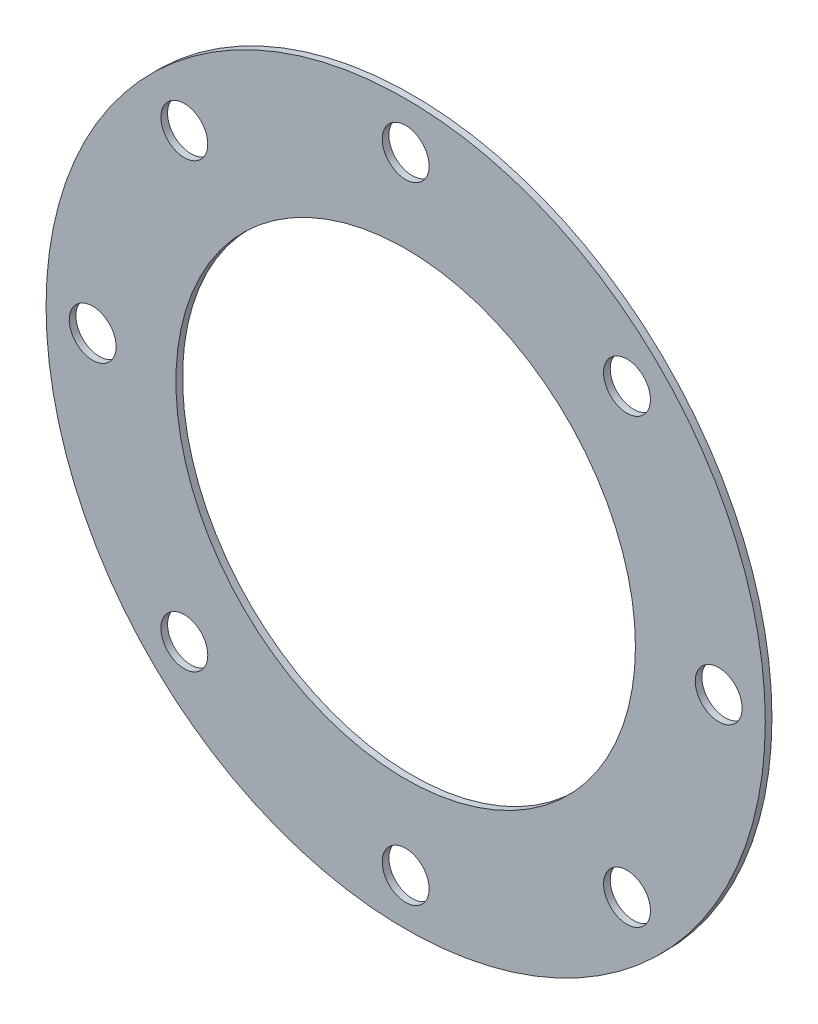
ISO-10303-21;
HEADER;
FILE_DESCRIPTION(('STEP AP214'),'2;1');
FILE_NAME('part.step','',(''),(''),'','','');
FILE_SCHEMA(('AUTOMOTIVE_DESIGN { 1 0 10303 214 1 1 1 1 }'));
ENDSEC;
DATA;
#1=APPLICATION_CONTEXT('core data for automotive mechanical design processes');
#2=APPLICATION_PROTOCOL_DEFINITION('international standard','automotive_design',2000,#1);
#3=PRODUCT_CONTEXT('',#1,'mechanical');
#4=PRODUCT('Part','Part','',(#3));
#5=PRODUCT_RELATED_PRODUCT_CATEGORY('part','',(#4));
#6=PRODUCT_DEFINITION_FORMATION('','',#4);
#7=PRODUCT_DEFINITION_CONTEXT('part definition',#1,'design');
#8=PRODUCT_DEFINITION('design','',#6,#7);
#9=PRODUCT_DEFINITION_SHAPE('','',#8);
#10=(LENGTH_UNIT() NAMED_UNIT(*) SI_UNIT(.MILLI.,.METRE.));
#11=(NAMED_UNIT(*) PLANE_ANGLE_UNIT() SI_UNIT($,.RADIAN.));
#12=(NAMED_UNIT(*) SI_UNIT($,.STERADIAN.) SOLID_ANGLE_UNIT());
#13=UNCERTAINTY_MEASURE_WITH_UNIT(LENGTH_MEASURE(1.E-05),#10,'distance_accuracy_value','');
#14=(GEOMETRIC_REPRESENTATION_CONTEXT(3) GLOBAL_UNCERTAINTY_ASSIGNED_CONTEXT((#13)) GLOBAL_UNIT_ASSIGNED_CONTEXT((#10,
#11,#12)) REPRESENTATION_CONTEXT('',''));
#15=CARTESIAN_POINT('',(0.,0.,0.));
#16=DIRECTION('',(0.,0.,1.));
#17=DIRECTION('',(1.,0.,0.));
#18=AXIS2_PLACEMENT_3D('',#15,#16,#17);
#19=CARTESIAN_POINT('',(0.,0.,1.5875));
#20=DIRECTION('',(0.,0.,1.));
#21=DIRECTION('',(1.,0.,0.));
#22=AXIS2_PLACEMENT_3D('',#19,#20,#21);
#23=PLANE('',#22);
#24=CARTESIAN_POINT('',(-105.518009422561,105.518009422564,1.5875));
#25=DIRECTION('',(0.,0.,1.));
#26=DIRECTION('',(0.707106781186556,0.707106781186539,0.));
#27=AXIS2_PLACEMENT_3D('',#24,#25,#26);
#28=CIRCLE('',#27,11.176);
#29=CARTESIAN_POINT('',(-97.6153840360203,113.420634809105,1.5875));
#30=VERTEX_POINT('',#29);
#31=EDGE_CURVE('E92',#30,#30,#28,.T.);
#32=ORIENTED_EDGE('',*,*,#31,.F.);
#33=EDGE_LOOP('',(#32));
#34=FACE_BOUND('',#33,.T.);
#35=CARTESIAN_POINT('',(-149.225,1.5630489083666E-12,1.5875));
#36=DIRECTION('',(0.,0.,1.));
#37=DIRECTION('',(0.,1.,0.));
#38=AXIS2_PLACEMENT_3D('',#35,#36,#37);
#39=CIRCLE('',#38,11.176);
#40=CARTESIAN_POINT('',(-149.225,11.1760000000016,1.5875));
#41=VERTEX_POINT('',#40);
#42=EDGE_CURVE('E86',#41,#41,#39,.T.);
#43=ORIENTED_EDGE('',*,*,#42,.F.);
#44=EDGE_LOOP('',(#43));
#45=FACE_BOUND('',#44,.T.);
#46=CARTESIAN_POINT('',(-105.518009422563,-105.518009422562,1.5875));
#47=DIRECTION('',(0.,0.,1.));
#48=DIRECTION('',(-0.707106781186541,0.707106781186554,0.));
#49=AXIS2_PLACEMENT_3D('',#46,#47,#48);
#50=CIRCLE('',#49,11.176);
#51=CARTESIAN_POINT('',(-113.420634809104,-97.6153840360207,1.5875));
#52=VERTEX_POINT('',#51);
#53=EDGE_CURVE('E80',#52,#52,#50,.T.);
#54=ORIENTED_EDGE('',*,*,#53,.F.);
#55=EDGE_LOOP('',(#54));
#56=FACE_BOUND('',#55,.T.);
#57=CARTESIAN_POINT('',(0.,-149.225,1.5875));
#58=DIRECTION('',(0.,0.,1.));
#59=DIRECTION('',(-1.,0.,0.));
#60=AXIS2_PLACEMENT_3D('',#57,#58,#59);
#61=CIRCLE('',#60,11.176);
#62=CARTESIAN_POINT('',(-11.176,-149.225,1.5875));
#63=VERTEX_POINT('',#62);
#64=EDGE_CURVE('E74',#63,#63,#61,.T.);
#65=ORIENTED_EDGE('',*,*,#64,.F.);
#66=EDGE_LOOP('',(#65));
#67=FACE_BOUND('',#66,.T.);
#68=CARTESIAN_POINT('',(105.518009422562,-105.518009422563,1.5875));
#69=DIRECTION('',(0.,0.,1.));
#70=DIRECTION('',(-0.707106781186551,-0.707106781186544,0.));
#71=AXIS2_PLACEMENT_3D('',#68,#69,#70);
#72=CIRCLE('',#71,11.176);
#73=CARTESIAN_POINT('',(97.6153840360211,-113.420634809104,1.5875));
#74=VERTEX_POINT('',#73);
#75=EDGE_CURVE('E68',#74,#74,#72,.T.);
#76=ORIENTED_EDGE('',*,*,#75,.F.);
#77=EDGE_LOOP('',(#76));
#78=FACE_BOUND('',#77,.T.);
#79=CARTESIAN_POINT('',(149.225,-5.21016302788867E-13,1.5875));
#80=DIRECTION('',(0.,0.,1.));
#81=DIRECTION('',(0.,-1.,0.));
#82=AXIS2_PLACEMENT_3D('',#79,#80,#81);
#83=CIRCLE('',#82,11.176);
#84=CARTESIAN_POINT('',(149.225,-11.1760000000005,1.5875));
#85=VERTEX_POINT('',#84);
#86=EDGE_CURVE('E62',#85,#85,#83,.T.);
#87=ORIENTED_EDGE('',*,*,#86,.F.);
#88=EDGE_LOOP('',(#87));
#89=FACE_BOUND('',#88,.T.);
#90=CARTESIAN_POINT('',(105.518009422563,105.518009422562,1.5875));
#91=DIRECTION('',(0.,0.,1.));
#92=DIRECTION('',(0.707106781186546,-0.707106781186549,0.));
#93=AXIS2_PLACEMENT_3D('',#90,#91,#92);
#94=CIRCLE('',#93,11.176);
#95=CARTESIAN_POINT('',(113.420634809104,97.6153840360215,1.5875));
#96=VERTEX_POINT('',#95);
#97=EDGE_CURVE('E56',#96,#96,#94,.T.);
#98=ORIENTED_EDGE('',*,*,#97,.F.);
#99=EDGE_LOOP('',(#98));
#100=FACE_BOUND('',#99,.T.);
#101=CARTESIAN_POINT('',(0.,149.225,1.5875));
#102=DIRECTION('',(0.,0.,1.));
#103=DIRECTION('',(1.,0.,0.));
#104=AXIS2_PLACEMENT_3D('',#101,#102,#103);
#105=CIRCLE('',#104,11.176);
#106=CARTESIAN_POINT('',(11.176,149.225,1.5875));
#107=VERTEX_POINT('',#106);
#108=EDGE_CURVE('E53',#107,#107,#105,.T.);
#109=ORIENTED_EDGE('',*,*,#108,.F.);
#110=EDGE_LOOP('',(#109));
#111=FACE_BOUND('',#110,.T.);
#112=CARTESIAN_POINT('',(0.,0.,1.5875));
#113=DIRECTION('',(0.,0.,1.));
#114=DIRECTION('',(1.,0.,0.));
#115=AXIS2_PLACEMENT_3D('',#112,#113,#114);
#116=CIRCLE('',#115,171.45);
#117=CARTESIAN_POINT('',(171.45,0.,1.5875));
#118=VERTEX_POINT('',#117);
#119=EDGE_CURVE('E10',#118,#118,#116,.T.);
#120=ORIENTED_EDGE('',*,*,#119,.T.);
#121=EDGE_LOOP('',(#120));
#122=FACE_BOUND('',#121,.T.);
#123=CARTESIAN_POINT('',(0.,0.,1.5875));
#124=DIRECTION('',(0.,0.,1.));
#125=DIRECTION('',(1.,0.,0.));
#126=AXIS2_PLACEMENT_3D('',#123,#124,#125);
#127=CIRCLE('',#126,109.5375);
#128=CARTESIAN_POINT('',(109.5375,0.,1.5875));
#129=VERTEX_POINT('',#128);
#130=EDGE_CURVE('E43',#129,#129,#127,.T.);
#131=ORIENTED_EDGE('',*,*,#130,.F.);
#132=EDGE_LOOP('',(#131));
#133=FACE_BOUND('',#132,.T.);
#134=ADVANCED_FACE('F32',(#34,#45,#56,#67,#78,#89,#100,#111,#122,#133),#23,.T.);
#135=CARTESIAN_POINT('',(0.,0.,-1.5875));
#136=DIRECTION('',(0.,0.,1.));
#137=DIRECTION('',(1.,0.,0.));
#138=AXIS2_PLACEMENT_3D('',#135,#136,#137);
#139=PLANE('',#138);
#140=CARTESIAN_POINT('',(-105.518009422561,105.518009422564,-1.5875));
#141=DIRECTION('',(0.,0.,1.));
#142=DIRECTION('',(0.707106781186556,0.707106781186539,0.));
#143=AXIS2_PLACEMENT_3D('',#140,#141,#142);
#144=CIRCLE('',#143,11.176);
#145=CARTESIAN_POINT('',(-97.6153840360203,113.420634809105,-1.5875));
#146=VERTEX_POINT('',#145);
#147=EDGE_CURVE('E95',#146,#146,#144,.T.);
#148=ORIENTED_EDGE('',*,*,#147,.T.);
#149=EDGE_LOOP('',(#148));
#150=FACE_BOUND('',#149,.T.);
#151=CARTESIAN_POINT('',(-149.225,1.5630489083666E-12,-1.5875));
#152=DIRECTION('',(0.,0.,1.));
#153=DIRECTION('',(0.,1.,0.));
#154=AXIS2_PLACEMENT_3D('',#151,#152,#153);
#155=CIRCLE('',#154,11.176);
#156=CARTESIAN_POINT('',(-149.225,11.1760000000016,-1.5875));
#157=VERTEX_POINT('',#156);
#158=EDGE_CURVE('E89',#157,#157,#155,.T.);
#159=ORIENTED_EDGE('',*,*,#158,.T.);
#160=EDGE_LOOP('',(#159));
#161=FACE_BOUND('',#160,.T.);
#162=CARTESIAN_POINT('',(-105.518009422563,-105.518009422562,-1.5875));
#163=DIRECTION('',(0.,0.,1.));
#164=DIRECTION('',(-0.707106781186541,0.707106781186554,0.));
#165=AXIS2_PLACEMENT_3D('',#162,#163,#164);
#166=CIRCLE('',#165,11.176);
#167=CARTESIAN_POINT('',(-113.420634809104,-97.6153840360207,-1.5875));
#168=VERTEX_POINT('',#167);
#169=EDGE_CURVE('E83',#168,#168,#166,.T.);
#170=ORIENTED_EDGE('',*,*,#169,.T.);
#171=EDGE_LOOP('',(#170));
#172=FACE_BOUND('',#171,.T.);
#173=CARTESIAN_POINT('',(0.,-149.225,-1.5875));
#174=DIRECTION('',(0.,0.,1.));
#175=DIRECTION('',(-1.,0.,0.));
#176=AXIS2_PLACEMENT_3D('',#173,#174,#175);
#177=CIRCLE('',#176,11.176);
#178=CARTESIAN_POINT('',(-11.176,-149.225,-1.5875));
#179=VERTEX_POINT('',#178);
#180=EDGE_CURVE('E77',#179,#179,#177,.T.);
#181=ORIENTED_EDGE('',*,*,#180,.T.);
#182=EDGE_LOOP('',(#181));
#183=FACE_BOUND('',#182,.T.);
#184=CARTESIAN_POINT('',(105.518009422562,-105.518009422563,-1.5875));
#185=DIRECTION('',(0.,0.,1.));
#186=DIRECTION('',(-0.707106781186551,-0.707106781186544,0.));
#187=AXIS2_PLACEMENT_3D('',#184,#185,#186);
#188=CIRCLE('',#187,11.176);
#189=CARTESIAN_POINT('',(97.6153840360211,-113.420634809104,-1.5875));
#190=VERTEX_POINT('',#189);
#191=EDGE_CURVE('E71',#190,#190,#188,.T.);
#192=ORIENTED_EDGE('',*,*,#191,.T.);
#193=EDGE_LOOP('',(#192));
#194=FACE_BOUND('',#193,.T.);
#195=CARTESIAN_POINT('',(149.225,-5.21016302788867E-13,-1.5875));
#196=DIRECTION('',(0.,0.,1.));
#197=DIRECTION('',(0.,-1.,0.));
#198=AXIS2_PLACEMENT_3D('',#195,#196,#197);
#199=CIRCLE('',#198,11.176);
#200=CARTESIAN_POINT('',(149.225,-11.1760000000005,-1.5875));
#201=VERTEX_POINT('',#200);
#202=EDGE_CURVE('E65',#201,#201,#199,.T.);
#203=ORIENTED_EDGE('',*,*,#202,.T.);
#204=EDGE_LOOP('',(#203));
#205=FACE_BOUND('',#204,.T.);
#206=CARTESIAN_POINT('',(105.518009422563,105.518009422562,-1.5875));
#207=DIRECTION('',(0.,0.,1.));
#208=DIRECTION('',(0.707106781186546,-0.707106781186549,0.));
#209=AXIS2_PLACEMENT_3D('',#206,#207,#208);
#210=CIRCLE('',#209,11.176);
#211=CARTESIAN_POINT('',(113.420634809104,97.6153840360215,-1.5875));
#212=VERTEX_POINT('',#211);
#213=EDGE_CURVE('E59',#212,#212,#210,.T.);
#214=ORIENTED_EDGE('',*,*,#213,.T.);
#215=EDGE_LOOP('',(#214));
#216=FACE_BOUND('',#215,.T.);
#217=CARTESIAN_POINT('',(0.,149.225,-1.5875));
#218=DIRECTION('',(0.,0.,1.));
#219=DIRECTION('',(1.,0.,0.));
#220=AXIS2_PLACEMENT_3D('',#217,#218,#219);
#221=CIRCLE('',#220,11.176);
#222=CARTESIAN_POINT('',(11.176,149.225,-1.5875));
#223=VERTEX_POINT('',#222);
#224=EDGE_CURVE('E48',#223,#223,#221,.T.);
#225=ORIENTED_EDGE('',*,*,#224,.T.);
#226=EDGE_LOOP('',(#225));
#227=FACE_BOUND('',#226,.T.);
#228=CARTESIAN_POINT('',(0.,0.,-1.5875));
#229=DIRECTION('',(0.,0.,1.));
#230=DIRECTION('',(1.,0.,0.));
#231=AXIS2_PLACEMENT_3D('',#228,#229,#230);
#232=CIRCLE('',#231,171.45);
#233=CARTESIAN_POINT('',(171.45,0.,-1.5875));
#234=VERTEX_POINT('',#233);
#235=EDGE_CURVE('E36',#234,#234,#232,.T.);
#236=ORIENTED_EDGE('',*,*,#235,.F.);
#237=EDGE_LOOP('',(#236));
#238=FACE_BOUND('',#237,.T.);
#239=CARTESIAN_POINT('',(0.,0.,-1.5875));
#240=DIRECTION('',(0.,0.,1.));
#241=DIRECTION('',(1.,0.,0.));
#242=AXIS2_PLACEMENT_3D('',#239,#240,#241);
#243=CIRCLE('',#242,109.5375);
#244=CARTESIAN_POINT('',(109.5375,0.,-1.5875));
#245=VERTEX_POINT('',#244);
#246=EDGE_CURVE('E45',#245,#245,#243,.T.);
#247=ORIENTED_EDGE('',*,*,#246,.T.);
#248=EDGE_LOOP('',(#247));
#249=FACE_BOUND('',#248,.T.);
#250=ADVANCED_FACE('F99',(#150,#161,#172,#183,#194,#205,#216,#227,#238,#249),#139,.F.);
#251=CARTESIAN_POINT('',(0.,0.,1.5875));
#252=DIRECTION('',(0.,0.,-1.));
#253=DIRECTION('',(-1.,0.,0.));
#254=AXIS2_PLACEMENT_3D('',#251,#252,#253);
#255=CYLINDRICAL_SURFACE('',#254,171.45);
#256=ORIENTED_EDGE('',*,*,#119,.F.);
#257=EDGE_LOOP('',(#256));
#258=FACE_BOUND('',#257,.T.);
#259=ORIENTED_EDGE('',*,*,#235,.T.);
#260=EDGE_LOOP('',(#259));
#261=FACE_BOUND('',#260,.T.);
#262=ADVANCED_FACE('F34',(#258,#261),#255,.T.);
#263=CARTESIAN_POINT('',(0.,0.,1.5875));
#264=DIRECTION('',(0.,0.,-1.));
#265=DIRECTION('',(-1.,0.,0.));
#266=AXIS2_PLACEMENT_3D('',#263,#264,#265);
#267=CYLINDRICAL_SURFACE('',#266,109.5375);
#268=ORIENTED_EDGE('',*,*,#130,.T.);
#269=EDGE_LOOP('',(#268));
#270=FACE_BOUND('',#269,.T.);
#271=ORIENTED_EDGE('',*,*,#246,.F.);
#272=EDGE_LOOP('',(#271));
#273=FACE_BOUND('',#272,.T.);
#274=ADVANCED_FACE('F128',(#270,#273),#267,.F.);
#275=CARTESIAN_POINT('',(0.,149.225,-1.5875));
#276=DIRECTION('',(0.,0.,1.));
#277=DIRECTION('',(1.,0.,0.));
#278=AXIS2_PLACEMENT_3D('',#275,#276,#277);
#279=CYLINDRICAL_SURFACE('',#278,11.176);
#280=ORIENTED_EDGE('',*,*,#224,.F.);
#281=EDGE_LOOP('',(#280));
#282=FACE_BOUND('',#281,.T.);
#283=ORIENTED_EDGE('',*,*,#108,.T.);
#284=EDGE_LOOP('',(#283));
#285=FACE_BOUND('',#284,.T.);
#286=ADVANCED_FACE('F131',(#282,#285),#279,.F.);
#287=CARTESIAN_POINT('',(105.518009422563,105.518009422562,-1.5875));
#288=DIRECTION('',(0.,0.,1.));
#289=DIRECTION('',(0.707106781186546,-0.707106781186549,0.));
#290=AXIS2_PLACEMENT_3D('',#287,#288,#289);
#291=CYLINDRICAL_SURFACE('',#290,11.176);
#292=ORIENTED_EDGE('',*,*,#213,.F.);
#293=EDGE_LOOP('',(#292));
#294=FACE_BOUND('',#293,.T.);
#295=ORIENTED_EDGE('',*,*,#97,.T.);
#296=EDGE_LOOP('',(#295));
#297=FACE_BOUND('',#296,.T.);
#298=ADVANCED_FACE('F143',(#294,#297),#291,.F.);
#299=CARTESIAN_POINT('',(149.225,-5.21016302788867E-13,-1.5875));
#300=DIRECTION('',(0.,0.,1.));
#301=DIRECTION('',(0.,-1.,0.));
#302=AXIS2_PLACEMENT_3D('',#299,#300,#301);
#303=CYLINDRICAL_SURFACE('',#302,11.176);
#304=ORIENTED_EDGE('',*,*,#202,.F.);
#305=EDGE_LOOP('',(#304));
#306=FACE_BOUND('',#305,.T.);
#307=ORIENTED_EDGE('',*,*,#86,.T.);
#308=EDGE_LOOP('',(#307));
#309=FACE_BOUND('',#308,.T.);
#310=ADVANCED_FACE('F147',(#306,#309),#303,.F.);
#311=CARTESIAN_POINT('',(105.518009422562,-105.518009422563,-1.5875));
#312=DIRECTION('',(0.,0.,1.));
#313=DIRECTION('',(-0.707106781186551,-0.707106781186544,0.));
#314=AXIS2_PLACEMENT_3D('',#311,#312,#313);
#315=CYLINDRICAL_SURFACE('',#314,11.176);
#316=ORIENTED_EDGE('',*,*,#191,.F.);
#317=EDGE_LOOP('',(#316));
#318=FACE_BOUND('',#317,.T.);
#319=ORIENTED_EDGE('',*,*,#75,.T.);
#320=EDGE_LOOP('',(#319));
#321=FACE_BOUND('',#320,.T.);
#322=ADVANCED_FACE('F151',(#318,#321),#315,.F.);
#323=CARTESIAN_POINT('',(0.,-149.225,-1.5875));
#324=DIRECTION('',(0.,0.,1.));
#325=DIRECTION('',(-1.,0.,0.));
#326=AXIS2_PLACEMENT_3D('',#323,#324,#325);
#327=CYLINDRICAL_SURFACE('',#326,11.176);
#328=ORIENTED_EDGE('',*,*,#180,.F.);
#329=EDGE_LOOP('',(#328));
#330=FACE_BOUND('',#329,.T.);
#331=ORIENTED_EDGE('',*,*,#64,.T.);
#332=EDGE_LOOP('',(#331));
#333=FACE_BOUND('',#332,.T.);
#334=ADVANCED_FACE('F155',(#330,#333),#327,.F.);
#335=CARTESIAN_POINT('',(-105.518009422563,-105.518009422562,-1.5875));
#336=DIRECTION('',(0.,0.,1.));
#337=DIRECTION('',(-0.707106781186541,0.707106781186554,0.));
#338=AXIS2_PLACEMENT_3D('',#335,#336,#337);
#339=CYLINDRICAL_SURFACE('',#338,11.176);
#340=ORIENTED_EDGE('',*,*,#169,.F.);
#341=EDGE_LOOP('',(#340));
#342=FACE_BOUND('',#341,.T.);
#343=ORIENTED_EDGE('',*,*,#53,.T.);
#344=EDGE_LOOP('',(#343));
#345=FACE_BOUND('',#344,.T.);
#346=ADVANCED_FACE('F159',(#342,#345),#339,.F.);
#347=CARTESIAN_POINT('',(-149.225,1.5630489083666E-12,-1.5875));
#348=DIRECTION('',(0.,0.,1.));
#349=DIRECTION('',(0.,1.,0.));
#350=AXIS2_PLACEMENT_3D('',#347,#348,#349);
#351=CYLINDRICAL_SURFACE('',#350,11.176);
#352=ORIENTED_EDGE('',*,*,#158,.F.);
#353=EDGE_LOOP('',(#352));
#354=FACE_BOUND('',#353,.T.);
#355=ORIENTED_EDGE('',*,*,#42,.T.);
#356=EDGE_LOOP('',(#355));
#357=FACE_BOUND('',#356,.T.);
#358=ADVANCED_FACE('F105',(#354,#357),#351,.F.);
#359=CARTESIAN_POINT('',(-105.518009422561,105.518009422564,-1.5875));
#360=DIRECTION('',(0.,0.,1.));
#361=DIRECTION('',(0.707106781186556,0.707106781186539,0.));
#362=AXIS2_PLACEMENT_3D('',#359,#360,#361);
#363=CYLINDRICAL_SURFACE('',#362,11.176);
#364=ORIENTED_EDGE('',*,*,#147,.F.);
#365=EDGE_LOOP('',(#364));
#366=FACE_BOUND('',#365,.T.);
#367=ORIENTED_EDGE('',*,*,#31,.T.);
#368=EDGE_LOOP('',(#367));
#369=FACE_BOUND('',#368,.T.);
#370=ADVANCED_FACE('F102',(#366,#369),#363,.F.);
#371=CLOSED_SHELL('',(#134,#250,#262,#274,#286,#298,#310,#322,#334,#346,#358,#370));
#372=MANIFOLD_SOLID_BREP('B2',#371);
#373=ADVANCED_BREP_SHAPE_REPRESENTATION('',(#18,#372),#14);
#374=SHAPE_DEFINITION_REPRESENTATION(#9,#373);
ENDSEC;
END-ISO-10303-21;
